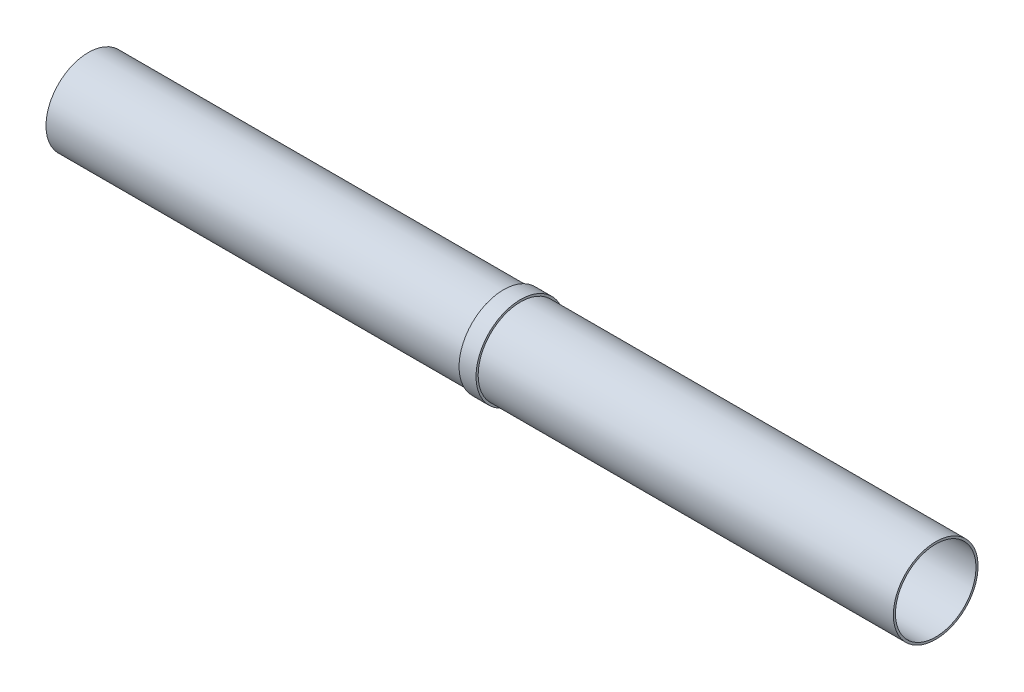
ISO-10303-21;
HEADER;
FILE_DESCRIPTION(('STEP AP214'),'2;1');
FILE_NAME('part.step','',(''),(''),'','','');
FILE_SCHEMA(('AUTOMOTIVE_DESIGN { 1 0 10303 214 1 1 1 1 }'));
ENDSEC;
DATA;
#1=APPLICATION_CONTEXT('core data for automotive mechanical design processes');
#2=APPLICATION_PROTOCOL_DEFINITION('international standard','automotive_design',2000,#1);
#3=PRODUCT_CONTEXT('',#1,'mechanical');
#4=PRODUCT('Part','Part','',(#3));
#5=PRODUCT_RELATED_PRODUCT_CATEGORY('part','',(#4));
#6=PRODUCT_DEFINITION_FORMATION('','',#4);
#7=PRODUCT_DEFINITION_CONTEXT('part definition',#1,'design');
#8=PRODUCT_DEFINITION('design','',#6,#7);
#9=PRODUCT_DEFINITION_SHAPE('','',#8);
#10=(LENGTH_UNIT() NAMED_UNIT(*) SI_UNIT(.MILLI.,.METRE.));
#11=(NAMED_UNIT(*) PLANE_ANGLE_UNIT() SI_UNIT($,.RADIAN.));
#12=(NAMED_UNIT(*) SI_UNIT($,.STERADIAN.) SOLID_ANGLE_UNIT());
#13=UNCERTAINTY_MEASURE_WITH_UNIT(LENGTH_MEASURE(1.E-05),#10,'distance_accuracy_value','');
#14=(GEOMETRIC_REPRESENTATION_CONTEXT(3) GLOBAL_UNCERTAINTY_ASSIGNED_CONTEXT((#13)) GLOBAL_UNIT_ASSIGNED_CONTEXT((#10,
#11,#12)) REPRESENTATION_CONTEXT('',''));
#15=CARTESIAN_POINT('',(0.,0.,0.));
#16=DIRECTION('',(0.,0.,1.));
#17=DIRECTION('',(1.,0.,0.));
#18=AXIS2_PLACEMENT_3D('',#15,#16,#17);
#19=CARTESIAN_POINT('',(635.,0.,0.));
#20=DIRECTION('',(-1.,0.,0.));
#21=DIRECTION('',(0.,0.,1.));
#22=AXIS2_PLACEMENT_3D('',#19,#20,#21);
#23=CYLINDRICAL_SURFACE('',#22,60.325);
#24=CARTESIAN_POINT('',(-635.,0.,0.));
#25=DIRECTION('',(1.,0.,0.));
#26=DIRECTION('',(0.,0.,-1.));
#27=AXIS2_PLACEMENT_3D('',#24,#25,#26);
#28=CIRCLE('',#27,60.325);
#29=CARTESIAN_POINT('',(-635.,0.,60.325));
#30=VERTEX_POINT('',#29);
#31=EDGE_CURVE('E50',#30,#30,#28,.T.);
#32=CARTESIAN_POINT('',(635.,0.,0.));
#33=DIRECTION('',(1.,0.,0.));
#34=DIRECTION('',(0.,0.,-1.));
#35=AXIS2_PLACEMENT_3D('',#32,#33,#34);
#36=CIRCLE('',#35,60.325);
#37=CARTESIAN_POINT('',(635.,0.,60.325));
#38=VERTEX_POINT('',#37);
#39=EDGE_CURVE('E44',#38,#38,#36,.T.);
#40=CARTESIAN_POINT('',(-635.,0.,60.325));
#41=CARTESIAN_POINT('',(-621.770833333333,0.,60.325));
#42=CARTESIAN_POINT('',(-608.541666666667,0.,60.325));
#43=CARTESIAN_POINT('',(-582.083333333333,0.,60.325));
#44=CARTESIAN_POINT('',(-568.854166666667,0.,60.325));
#45=CARTESIAN_POINT('',(-542.395833333333,0.,60.325));
#46=CARTESIAN_POINT('',(-529.166666666667,0.,60.325));
#47=CARTESIAN_POINT('',(-502.708333333334,0.,60.325));
#48=CARTESIAN_POINT('',(-489.479166666667,0.,60.325));
#49=CARTESIAN_POINT('',(-463.020833333334,0.,60.325));
#50=CARTESIAN_POINT('',(-449.791666666667,0.,60.325));
#51=CARTESIAN_POINT('',(-423.333333333333,0.,60.325));
#52=CARTESIAN_POINT('',(-410.104166666667,0.,60.325));
#53=CARTESIAN_POINT('',(-383.645833333333,0.,60.325));
#54=CARTESIAN_POINT('',(-370.416666666667,0.,60.325));
#55=CARTESIAN_POINT('',(-343.958333333334,0.,60.325));
#56=CARTESIAN_POINT('',(-330.729166666667,0.,60.325));
#57=CARTESIAN_POINT('',(-304.270833333334,0.,60.325));
#58=CARTESIAN_POINT('',(-291.041666666667,0.,60.325));
#59=CARTESIAN_POINT('',(-264.583333333334,0.,60.325));
#60=CARTESIAN_POINT('',(-251.354166666667,0.,60.325));
#61=CARTESIAN_POINT('',(-224.895833333334,0.,60.325));
#62=CARTESIAN_POINT('',(-211.666666666667,0.,60.325));
#63=CARTESIAN_POINT('',(-185.208333333334,0.,60.325));
#64=CARTESIAN_POINT('',(-171.979166666667,0.,60.325));
#65=CARTESIAN_POINT('',(-145.520833333334,0.,60.325));
#66=CARTESIAN_POINT('',(-132.291666666667,0.,60.325));
#67=CARTESIAN_POINT('',(-105.833333333333,0.,60.325));
#68=CARTESIAN_POINT('',(-92.6041666666668,0.,60.325));
#69=CARTESIAN_POINT('',(-66.1458333333334,0.,60.325));
#70=CARTESIAN_POINT('',(-52.9166666666668,0.,60.325));
#71=CARTESIAN_POINT('',(-26.4583333333334,0.,60.325));
#72=CARTESIAN_POINT('',(-13.2291666666668,0.,60.325));
#73=CARTESIAN_POINT('',(13.2291666666666,0.,60.325));
#74=CARTESIAN_POINT('',(26.4583333333332,0.,60.325));
#75=CARTESIAN_POINT('',(52.9166666666665,0.,60.325));
#76=CARTESIAN_POINT('',(66.1458333333332,0.,60.325));
#77=CARTESIAN_POINT('',(92.6041666666666,0.,60.325));
#78=CARTESIAN_POINT('',(105.833333333333,0.,60.325));
#79=CARTESIAN_POINT('',(132.291666666667,0.,60.325));
#80=CARTESIAN_POINT('',(145.520833333333,0.,60.325));
#81=CARTESIAN_POINT('',(171.979166666667,0.,60.325));
#82=CARTESIAN_POINT('',(185.208333333333,0.,60.325));
#83=CARTESIAN_POINT('',(211.666666666667,0.,60.325));
#84=CARTESIAN_POINT('',(224.895833333333,0.,60.325));
#85=CARTESIAN_POINT('',(251.354166666667,0.,60.325));
#86=CARTESIAN_POINT('',(264.583333333333,0.,60.325));
#87=CARTESIAN_POINT('',(291.041666666667,0.,60.325));
#88=CARTESIAN_POINT('',(304.270833333333,0.,60.325));
#89=CARTESIAN_POINT('',(330.729166666667,0.,60.325));
#90=CARTESIAN_POINT('',(343.958333333333,0.,60.325));
#91=CARTESIAN_POINT('',(370.416666666667,0.,60.325));
#92=CARTESIAN_POINT('',(383.645833333333,0.,60.325));
#93=CARTESIAN_POINT('',(410.104166666667,0.,60.325));
#94=CARTESIAN_POINT('',(423.333333333333,0.,60.325));
#95=CARTESIAN_POINT('',(449.791666666667,0.,60.325));
#96=CARTESIAN_POINT('',(463.020833333333,0.,60.325));
#97=CARTESIAN_POINT('',(489.479166666667,0.,60.325));
#98=CARTESIAN_POINT('',(502.708333333333,0.,60.325));
#99=CARTESIAN_POINT('',(529.166666666667,0.,60.325));
#100=CARTESIAN_POINT('',(542.395833333333,0.,60.325));
#101=CARTESIAN_POINT('',(568.854166666667,0.,60.325));
#102=CARTESIAN_POINT('',(582.083333333333,0.,60.325));
#103=CARTESIAN_POINT('',(608.541666666667,0.,60.325));
#104=CARTESIAN_POINT('',(621.770833333333,0.,60.325));
#105=CARTESIAN_POINT('',(635.,0.,60.325));
#106=B_SPLINE_CURVE_WITH_KNOTS('',3,(#40,#41,#42,#43,#44,#45,#46,#47,#48,#49,#50,#51,#52,#53,
#54,#55,#56,#57,#58,#59,#60,#61,#62,#63,#64,#65,#66,#67,#68,#69,#70,#71,#72,#73,#74,#75,#76,#77,
#78,#79,#80,#81,#82,#83,#84,#85,#86,#87,#88,#89,#90,#91,#92,#93,#94,#95,#96,#97,#98,#99,#100,
#101,#102,#103,#104,#105),.UNSPECIFIED.,.F.,.F.,(4,2,2,2,2,2,2,2,2,2,2,2,2,2,2,2,2,2,2,2,2,2,2,
2,2,2,2,2,2,2,2,2,4),(0.,39.6875000000001,79.375,119.0625,158.75,198.4375,238.125,277.8125,
317.5,357.1875,396.875,436.5625,476.25,515.9375,555.625,595.3125,635.,674.6875,714.375,754.0625,
793.75,833.4375,873.125,912.8125,952.5,992.1875,1031.875,1071.5625,1111.25,1150.9375,1190.625,
1230.3125,1270.),.UNSPECIFIED.);
#107=EDGE_CURVE('BSEAM33',#30,#38,#106,.T.);
#108=ORIENTED_EDGE('',*,*,#31,.F.);
#109=ORIENTED_EDGE('',*,*,#39,.T.);
#110=ORIENTED_EDGE('',*,*,#107,.T.);
#111=ORIENTED_EDGE('',*,*,#107,.F.);
#112=EDGE_LOOP('',(#108,#110,#109,#111));
#113=FACE_BOUND('',#112,.T.);
#114=ADVANCED_FACE('F33',(#113),#23,.F.);
#115=CARTESIAN_POINT('',(635.,0.,0.));
#116=DIRECTION('',(-1.,0.,0.));
#117=DIRECTION('',(0.,0.,1.));
#118=AXIS2_PLACEMENT_3D('',#115,#116,#117);
#119=CYLINDRICAL_SURFACE('',#118,63.5);
#120=CARTESIAN_POINT('',(12.7,0.,0.));
#121=DIRECTION('',(1.,0.,0.));
#122=DIRECTION('',(0.,0.,-1.));
#123=AXIS2_PLACEMENT_3D('',#120,#121,#122);
#124=CIRCLE('',#123,63.5);
#125=CARTESIAN_POINT('',(12.7,0.,63.5));
#126=VERTEX_POINT('',#125);
#127=EDGE_CURVE('E36',#126,#126,#124,.T.);
#128=CARTESIAN_POINT('',(635.,0.,0.));
#129=DIRECTION('',(1.,0.,0.));
#130=DIRECTION('',(0.,0.,-1.));
#131=AXIS2_PLACEMENT_3D('',#128,#129,#130);
#132=CIRCLE('',#131,63.5);
#133=CARTESIAN_POINT('',(635.,0.,63.5));
#134=VERTEX_POINT('',#133);
#135=EDGE_CURVE('E40',#134,#134,#132,.T.);
#136=CARTESIAN_POINT('',(12.7,0.,63.5));
#137=CARTESIAN_POINT('',(19.1822916666667,0.,63.5));
#138=CARTESIAN_POINT('',(25.6645833333334,0.,63.5));
#139=CARTESIAN_POINT('',(38.6291666666667,0.,63.5));
#140=CARTESIAN_POINT('',(45.1114583333333,0.,63.5));
#141=CARTESIAN_POINT('',(58.0760416666667,0.,63.5));
#142=CARTESIAN_POINT('',(64.5583333333334,0.,63.5));
#143=CARTESIAN_POINT('',(77.5229166666667,0.,63.5));
#144=CARTESIAN_POINT('',(84.0052083333334,0.,63.5));
#145=CARTESIAN_POINT('',(96.9697916666667,0.,63.5));
#146=CARTESIAN_POINT('',(103.452083333333,0.,63.5));
#147=CARTESIAN_POINT('',(116.416666666667,0.,63.5));
#148=CARTESIAN_POINT('',(122.898958333333,0.,63.5));
#149=CARTESIAN_POINT('',(135.863541666667,0.,63.5));
#150=CARTESIAN_POINT('',(142.345833333333,0.,63.5));
#151=CARTESIAN_POINT('',(155.310416666667,0.,63.5));
#152=CARTESIAN_POINT('',(161.792708333333,0.,63.5));
#153=CARTESIAN_POINT('',(174.757291666667,0.,63.5));
#154=CARTESIAN_POINT('',(181.239583333333,0.,63.5));
#155=CARTESIAN_POINT('',(194.204166666667,0.,63.5));
#156=CARTESIAN_POINT('',(200.686458333333,0.,63.5));
#157=CARTESIAN_POINT('',(213.651041666667,0.,63.5));
#158=CARTESIAN_POINT('',(220.133333333333,0.,63.5));
#159=CARTESIAN_POINT('',(233.097916666667,0.,63.5));
#160=CARTESIAN_POINT('',(239.580208333333,0.,63.5));
#161=CARTESIAN_POINT('',(252.544791666667,0.,63.5));
#162=CARTESIAN_POINT('',(259.027083333333,0.,63.5));
#163=CARTESIAN_POINT('',(271.991666666667,0.,63.5));
#164=CARTESIAN_POINT('',(278.473958333333,0.,63.5));
#165=CARTESIAN_POINT('',(291.438541666667,0.,63.5));
#166=CARTESIAN_POINT('',(297.920833333333,0.,63.5));
#167=CARTESIAN_POINT('',(310.885416666667,0.,63.5));
#168=CARTESIAN_POINT('',(317.367708333333,0.,63.5));
#169=CARTESIAN_POINT('',(330.332291666667,0.,63.5));
#170=CARTESIAN_POINT('',(336.814583333333,0.,63.5));
#171=CARTESIAN_POINT('',(349.779166666667,0.,63.5));
#172=CARTESIAN_POINT('',(356.261458333333,0.,63.5));
#173=CARTESIAN_POINT('',(369.226041666667,0.,63.5));
#174=CARTESIAN_POINT('',(375.708333333333,0.,63.5));
#175=CARTESIAN_POINT('',(388.672916666667,0.,63.5));
#176=CARTESIAN_POINT('',(395.155208333333,0.,63.5));
#177=CARTESIAN_POINT('',(408.119791666667,0.,63.5));
#178=CARTESIAN_POINT('',(414.602083333333,0.,63.5));
#179=CARTESIAN_POINT('',(427.566666666667,0.,63.5));
#180=CARTESIAN_POINT('',(434.048958333333,0.,63.5));
#181=CARTESIAN_POINT('',(447.013541666667,0.,63.5));
#182=CARTESIAN_POINT('',(453.495833333333,0.,63.5));
#183=CARTESIAN_POINT('',(466.460416666667,0.,63.5));
#184=CARTESIAN_POINT('',(472.942708333333,0.,63.5));
#185=CARTESIAN_POINT('',(485.907291666667,0.,63.5));
#186=CARTESIAN_POINT('',(492.389583333333,0.,63.5));
#187=CARTESIAN_POINT('',(505.354166666667,0.,63.5));
#188=CARTESIAN_POINT('',(511.836458333333,0.,63.5));
#189=CARTESIAN_POINT('',(524.801041666667,0.,63.5));
#190=CARTESIAN_POINT('',(531.283333333333,0.,63.5));
#191=CARTESIAN_POINT('',(544.247916666667,0.,63.5));
#192=CARTESIAN_POINT('',(550.730208333333,0.,63.5));
#193=CARTESIAN_POINT('',(563.694791666667,0.,63.5));
#194=CARTESIAN_POINT('',(570.177083333333,0.,63.5));
#195=CARTESIAN_POINT('',(583.141666666667,0.,63.5));
#196=CARTESIAN_POINT('',(589.623958333333,0.,63.5));
#197=CARTESIAN_POINT('',(602.588541666667,0.,63.5));
#198=CARTESIAN_POINT('',(609.070833333333,0.,63.5));
#199=CARTESIAN_POINT('',(622.035416666667,0.,63.5));
#200=CARTESIAN_POINT('',(628.517708333333,0.,63.5));
#201=CARTESIAN_POINT('',(635.,0.,63.5));
#202=B_SPLINE_CURVE_WITH_KNOTS('',3,(#136,#137,#138,#139,#140,#141,#142,#143,#144,#145,#146,
#147,#148,#149,#150,#151,#152,#153,#154,#155,#156,#157,#158,#159,#160,#161,#162,#163,#164,#165,
#166,#167,#168,#169,#170,#171,#172,#173,#174,#175,#176,#177,#178,#179,#180,#181,#182,#183,#184,
#185,#186,#187,#188,#189,#190,#191,#192,#193,#194,#195,#196,#197,#198,#199,#200,#201),
.UNSPECIFIED.,.F.,.F.,(4,2,2,2,2,2,2,2,2,2,2,2,2,2,2,2,2,2,2,2,2,2,2,2,2,2,2,2,2,2,2,2,4),(0.,
19.446875,38.8937499999999,58.340625,77.7875,97.234375,116.68125,136.128125,155.575,175.021875,
194.46875,213.915625,233.3625,252.809375,272.25625,291.703125,311.15,330.596875,350.04375,
369.490625,388.9375,408.384375,427.83125,447.278125,466.725,486.171875,505.61875,525.065625,
544.5125,563.959375,583.40625,602.853125,622.3),.UNSPECIFIED.);
#203=EDGE_CURVE('BSEAM65',#126,#134,#202,.T.);
#204=ORIENTED_EDGE('',*,*,#127,.T.);
#205=ORIENTED_EDGE('',*,*,#135,.F.);
#206=ORIENTED_EDGE('',*,*,#203,.T.);
#207=ORIENTED_EDGE('',*,*,#203,.F.);
#208=EDGE_LOOP('',(#204,#206,#205,#207));
#209=FACE_BOUND('',#208,.T.);
#210=ADVANCED_FACE('F65',(#209),#119,.T.);
#211=CARTESIAN_POINT('',(635.,0.,0.));
#212=DIRECTION('',(1.,0.,0.));
#213=DIRECTION('',(0.,0.,-1.));
#214=AXIS2_PLACEMENT_3D('',#211,#212,#213);
#215=PLANE('',#214);
#216=ORIENTED_EDGE('',*,*,#39,.F.);
#217=EDGE_LOOP('',(#216));
#218=FACE_BOUND('',#217,.T.);
#219=ORIENTED_EDGE('',*,*,#135,.T.);
#220=EDGE_LOOP('',(#219));
#221=FACE_BOUND('',#220,.T.);
#222=ADVANCED_FACE('F80',(#218,#221),#215,.T.);
#223=CARTESIAN_POINT('',(-12.7,0.,0.));
#224=DIRECTION('',(1.,0.,0.));
#225=DIRECTION('',(0.,0.,-1.));
#226=AXIS2_PLACEMENT_3D('',#223,#224,#225);
#227=PLANE('',#226);
#228=CARTESIAN_POINT('',(-12.7,0.,0.));
#229=DIRECTION('',(1.,0.,0.));
#230=DIRECTION('',(0.,0.,-1.));
#231=AXIS2_PLACEMENT_3D('',#228,#229,#230);
#232=CIRCLE('',#231,63.5);
#233=CARTESIAN_POINT('',(-12.7,0.,63.5));
#234=VERTEX_POINT('',#233);
#235=EDGE_CURVE('E10',#234,#234,#232,.T.);
#236=ORIENTED_EDGE('',*,*,#235,.T.);
#237=EDGE_LOOP('',(#236));
#238=FACE_BOUND('',#237,.T.);
#239=CARTESIAN_POINT('',(-12.7,0.,0.));
#240=DIRECTION('',(1.,0.,0.));
#241=DIRECTION('',(0.,0.,-1.));
#242=AXIS2_PLACEMENT_3D('',#239,#240,#241);
#243=CIRCLE('',#242,66.675);
#244=CARTESIAN_POINT('',(-12.7,0.,-66.675));
#245=VERTEX_POINT('',#244);
#246=EDGE_CURVE('E55',#245,#245,#243,.T.);
#247=ORIENTED_EDGE('',*,*,#246,.F.);
#248=EDGE_LOOP('',(#247));
#249=FACE_BOUND('',#248,.T.);
#250=ADVANCED_FACE('F71',(#238,#249),#227,.F.);
#251=CARTESIAN_POINT('',(12.7,0.,0.));
#252=DIRECTION('',(1.,0.,0.));
#253=DIRECTION('',(0.,0.,-1.));
#254=AXIS2_PLACEMENT_3D('',#251,#252,#253);
#255=PLANE('',#254);
#256=ORIENTED_EDGE('',*,*,#127,.F.);
#257=EDGE_LOOP('',(#256));
#258=FACE_BOUND('',#257,.T.);
#259=CARTESIAN_POINT('',(12.7,0.,0.));
#260=DIRECTION('',(1.,0.,0.));
#261=DIRECTION('',(0.,0.,-1.));
#262=AXIS2_PLACEMENT_3D('',#259,#260,#261);
#263=CIRCLE('',#262,66.675);
#264=CARTESIAN_POINT('',(12.7,0.,-66.675));
#265=VERTEX_POINT('',#264);
#266=EDGE_CURVE('E58',#265,#265,#263,.T.);
#267=ORIENTED_EDGE('',*,*,#266,.T.);
#268=EDGE_LOOP('',(#267));
#269=FACE_BOUND('',#268,.T.);
#270=ADVANCED_FACE('F68',(#258,#269),#255,.T.);
#271=CARTESIAN_POINT('',(12.7,0.,0.));
#272=DIRECTION('',(-1.,0.,0.));
#273=DIRECTION('',(0.,0.,1.));
#274=AXIS2_PLACEMENT_3D('',#271,#272,#273);
#275=CYLINDRICAL_SURFACE('',#274,66.675);
#276=ORIENTED_EDGE('',*,*,#266,.F.);
#277=EDGE_LOOP('',(#276));
#278=FACE_BOUND('',#277,.T.);
#279=ORIENTED_EDGE('',*,*,#246,.T.);
#280=EDGE_LOOP('',(#279));
#281=FACE_BOUND('',#280,.T.);
#282=ADVANCED_FACE('F70',(#278,#281),#275,.T.);
#283=CARTESIAN_POINT('',(-635.,0.,0.));
#284=DIRECTION('',(1.,0.,0.));
#285=DIRECTION('',(0.,0.,-1.));
#286=AXIS2_PLACEMENT_3D('',#283,#284,#285);
#287=PLANE('',#286);
#288=ORIENTED_EDGE('',*,*,#31,.T.);
#289=EDGE_LOOP('',(#288));
#290=FACE_BOUND('',#289,.T.);
#291=CARTESIAN_POINT('',(-635.,0.,0.));
#292=DIRECTION('',(1.,0.,0.));
#293=DIRECTION('',(0.,0.,-1.));
#294=AXIS2_PLACEMENT_3D('',#291,#292,#293);
#295=CIRCLE('',#294,63.5);
#296=CARTESIAN_POINT('',(-635.,0.,63.5));
#297=VERTEX_POINT('',#296);
#298=EDGE_CURVE('E47',#297,#297,#295,.T.);
#299=ORIENTED_EDGE('',*,*,#298,.F.);
#300=EDGE_LOOP('',(#299));
#301=FACE_BOUND('',#300,.T.);
#302=ADVANCED_FACE('F77',(#290,#301),#287,.F.);
#303=CARTESIAN_POINT('',(-635.,0.,63.5));
#304=CARTESIAN_POINT('',(-628.517708333334,0.,63.5));
#305=CARTESIAN_POINT('',(-622.035416666667,0.,63.5));
#306=CARTESIAN_POINT('',(-609.070833333334,0.,63.5));
#307=CARTESIAN_POINT('',(-602.588541666667,0.,63.5));
#308=CARTESIAN_POINT('',(-589.623958333334,0.,63.5));
#309=CARTESIAN_POINT('',(-583.141666666667,0.,63.5));
#310=CARTESIAN_POINT('',(-570.177083333333,0.,63.5));
#311=CARTESIAN_POINT('',(-563.694791666667,0.,63.5));
#312=CARTESIAN_POINT('',(-550.730208333334,0.,63.5));
#313=CARTESIAN_POINT('',(-544.247916666667,0.,63.5));
#314=CARTESIAN_POINT('',(-531.283333333334,0.,63.5));
#315=CARTESIAN_POINT('',(-524.801041666667,0.,63.5));
#316=CARTESIAN_POINT('',(-511.836458333333,0.,63.5));
#317=CARTESIAN_POINT('',(-505.354166666667,0.,63.5));
#318=CARTESIAN_POINT('',(-492.389583333333,0.,63.5));
#319=CARTESIAN_POINT('',(-485.907291666667,0.,63.5));
#320=CARTESIAN_POINT('',(-472.942708333334,0.,63.5));
#321=CARTESIAN_POINT('',(-466.460416666667,0.,63.5));
#322=CARTESIAN_POINT('',(-453.495833333334,0.,63.5));
#323=CARTESIAN_POINT('',(-447.013541666667,0.,63.5));
#324=CARTESIAN_POINT('',(-434.048958333334,0.,63.5));
#325=CARTESIAN_POINT('',(-427.566666666667,0.,63.5));
#326=CARTESIAN_POINT('',(-414.602083333333,0.,63.5));
#327=CARTESIAN_POINT('',(-408.119791666667,0.,63.5));
#328=CARTESIAN_POINT('',(-395.155208333333,0.,63.5));
#329=CARTESIAN_POINT('',(-388.672916666667,0.,63.5));
#330=CARTESIAN_POINT('',(-375.708333333334,0.,63.5));
#331=CARTESIAN_POINT('',(-369.226041666667,0.,63.5));
#332=CARTESIAN_POINT('',(-356.261458333334,0.,63.5));
#333=CARTESIAN_POINT('',(-349.779166666667,0.,63.5));
#334=CARTESIAN_POINT('',(-336.814583333334,0.,63.5));
#335=CARTESIAN_POINT('',(-330.332291666667,0.,63.5));
#336=CARTESIAN_POINT('',(-317.367708333334,0.,63.5));
#337=CARTESIAN_POINT('',(-310.885416666667,0.,63.5));
#338=CARTESIAN_POINT('',(-297.920833333334,0.,63.5));
#339=CARTESIAN_POINT('',(-291.438541666667,0.,63.5));
#340=CARTESIAN_POINT('',(-278.473958333333,0.,63.5));
#341=CARTESIAN_POINT('',(-271.991666666667,0.,63.5));
#342=CARTESIAN_POINT('',(-259.027083333334,0.,63.5));
#343=CARTESIAN_POINT('',(-252.544791666667,0.,63.5));
#344=CARTESIAN_POINT('',(-239.580208333334,0.,63.5));
#345=CARTESIAN_POINT('',(-233.097916666667,0.,63.5));
#346=CARTESIAN_POINT('',(-220.133333333333,0.,63.5));
#347=CARTESIAN_POINT('',(-213.651041666667,0.,63.5));
#348=CARTESIAN_POINT('',(-200.686458333333,0.,63.5));
#349=CARTESIAN_POINT('',(-194.204166666667,0.,63.5));
#350=CARTESIAN_POINT('',(-181.239583333333,0.,63.5));
#351=CARTESIAN_POINT('',(-174.757291666667,0.,63.5));
#352=CARTESIAN_POINT('',(-161.792708333333,0.,63.5));
#353=CARTESIAN_POINT('',(-155.310416666667,0.,63.5));
#354=CARTESIAN_POINT('',(-142.345833333333,0.,63.5));
#355=CARTESIAN_POINT('',(-135.863541666667,0.,63.5));
#356=CARTESIAN_POINT('',(-122.898958333333,0.,63.5));
#357=CARTESIAN_POINT('',(-116.416666666667,0.,63.5));
#358=CARTESIAN_POINT('',(-103.452083333333,0.,63.5));
#359=CARTESIAN_POINT('',(-96.9697916666668,0.,63.5));
#360=CARTESIAN_POINT('',(-84.0052083333334,0.,63.5));
#361=CARTESIAN_POINT('',(-77.5229166666667,0.,63.5));
#362=CARTESIAN_POINT('',(-64.5583333333334,0.,63.5));
#363=CARTESIAN_POINT('',(-58.0760416666668,0.,63.5));
#364=CARTESIAN_POINT('',(-45.1114583333334,0.,63.5));
#365=CARTESIAN_POINT('',(-38.6291666666667,0.,63.5));
#366=CARTESIAN_POINT('',(-25.6645833333334,0.,63.5));
#367=CARTESIAN_POINT('',(-19.1822916666667,0.,63.5));
#368=CARTESIAN_POINT('',(-12.7,0.,63.5));
#369=B_SPLINE_CURVE_WITH_KNOTS('',3,(#303,#304,#305,#306,#307,#308,#309,#310,#311,#312,#313,
#314,#315,#316,#317,#318,#319,#320,#321,#322,#323,#324,#325,#326,#327,#328,#329,#330,#331,#332,
#333,#334,#335,#336,#337,#338,#339,#340,#341,#342,#343,#344,#345,#346,#347,#348,#349,#350,#351,
#352,#353,#354,#355,#356,#357,#358,#359,#360,#361,#362,#363,#364,#365,#366,#367,#368),
.UNSPECIFIED.,.F.,.F.,(4,2,2,2,2,2,2,2,2,2,2,2,2,2,2,2,2,2,2,2,2,2,2,2,2,2,2,2,2,2,2,2,4),(0.,
19.4468750000001,38.8937499999999,58.340625,77.7875000000001,97.234375,116.68125,136.128125,
155.575,175.021875,194.46875,213.915625,233.3625,252.809375,272.25625,291.703125,311.15,
330.596875,350.04375,369.490625,388.9375,408.384375,427.83125,447.278125,466.725,486.171875,
505.61875,525.065625,544.5125,563.959375,583.40625,602.853125,622.3),.UNSPECIFIED.);
#370=EDGE_CURVE('BSEAM87',#297,#234,#369,.T.);
#371=ORIENTED_EDGE('',*,*,#298,.T.);
#372=ORIENTED_EDGE('',*,*,#235,.F.);
#373=ORIENTED_EDGE('',*,*,#370,.T.);
#374=ORIENTED_EDGE('',*,*,#370,.F.);
#375=EDGE_LOOP('',(#371,#373,#372,#374));
#376=FACE_BOUND('',#375,.T.);
#377=ADVANCED_FACE('F87',(#376),#119,.T.);
#378=CLOSED_SHELL('',(#114,#210,#222,#250,#270,#282,#302,#377));
#379=MANIFOLD_SOLID_BREP('B2',#378);
#380=ADVANCED_BREP_SHAPE_REPRESENTATION('',(#18,#379),#14);
#381=SHAPE_DEFINITION_REPRESENTATION(#9,#380);
ENDSEC;
END-ISO-10303-21;
